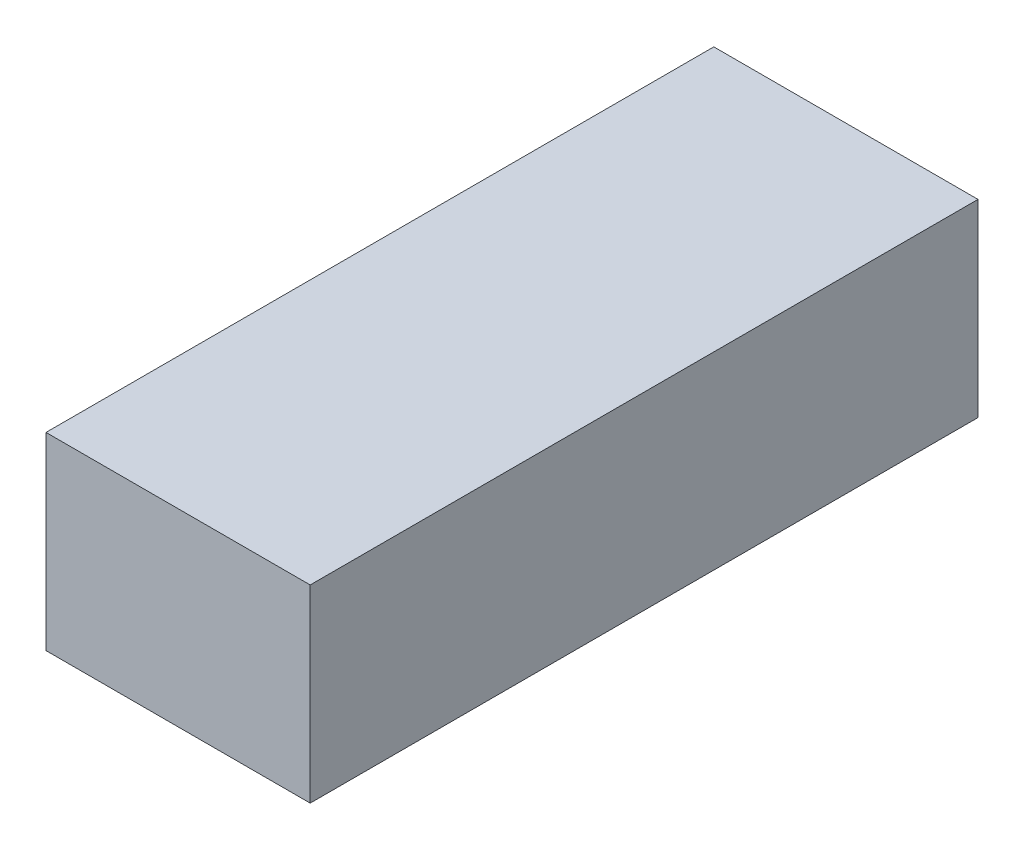
ISO-10303-21;
HEADER;
FILE_DESCRIPTION(('STEP AP214'),'2;1');
FILE_NAME('part.step','',(''),(''),'','','');
FILE_SCHEMA(('AUTOMOTIVE_DESIGN { 1 0 10303 214 1 1 1 1 }'));
ENDSEC;
DATA;
#1=APPLICATION_CONTEXT('core data for automotive mechanical design processes');
#2=APPLICATION_PROTOCOL_DEFINITION('international standard','automotive_design',2000,#1);
#3=PRODUCT_CONTEXT('',#1,'mechanical');
#4=PRODUCT('Part','Part','',(#3));
#5=PRODUCT_RELATED_PRODUCT_CATEGORY('part','',(#4));
#6=PRODUCT_DEFINITION_FORMATION('','',#4);
#7=PRODUCT_DEFINITION_CONTEXT('part definition',#1,'design');
#8=PRODUCT_DEFINITION('design','',#6,#7);
#9=PRODUCT_DEFINITION_SHAPE('','',#8);
#10=(LENGTH_UNIT() NAMED_UNIT(*) SI_UNIT(.MILLI.,.METRE.));
#11=(NAMED_UNIT(*) PLANE_ANGLE_UNIT() SI_UNIT($,.RADIAN.));
#12=(NAMED_UNIT(*) SI_UNIT($,.STERADIAN.) SOLID_ANGLE_UNIT());
#13=UNCERTAINTY_MEASURE_WITH_UNIT(LENGTH_MEASURE(1.E-05),#10,'distance_accuracy_value','');
#14=(GEOMETRIC_REPRESENTATION_CONTEXT(3) GLOBAL_UNCERTAINTY_ASSIGNED_CONTEXT((#13)) GLOBAL_UNIT_ASSIGNED_CONTEXT((#10,
#11,#12)) REPRESENTATION_CONTEXT('',''));
#15=CARTESIAN_POINT('',(0.,0.,0.));
#16=DIRECTION('',(0.,0.,1.));
#17=DIRECTION('',(1.,0.,0.));
#18=AXIS2_PLACEMENT_3D('',#15,#16,#17);
#19=CARTESIAN_POINT('',(-36.,25.75,-91.));
#20=DIRECTION('',(1.,0.,0.));
#21=DIRECTION('',(0.,0.,-1.));
#22=AXIS2_PLACEMENT_3D('',#19,#20,#21);
#23=PLANE('',#22);
#24=DIRECTION('',(0.,0.,1.));
#25=VECTOR('',#24,1.);
#26=CARTESIAN_POINT('',(-36.,-25.75,-91.));
#27=LINE('',#26,#25);
#28=CARTESIAN_POINT('',(-36.,-25.75,-91.));
#29=VERTEX_POINT('',#28);
#30=CARTESIAN_POINT('',(-36.,-25.75,91.));
#31=VERTEX_POINT('',#30);
#32=EDGE_CURVE('E107',#29,#31,#27,.T.);
#33=ORIENTED_EDGE('',*,*,#32,.T.);
#34=DIRECTION('',(0.,-1.,0.));
#35=VECTOR('',#34,1.);
#36=CARTESIAN_POINT('',(-36.,25.75,91.));
#37=LINE('',#36,#35);
#38=CARTESIAN_POINT('',(-36.,25.75,91.));
#39=VERTEX_POINT('',#38);
#40=EDGE_CURVE('E11',#39,#31,#37,.T.);
#41=ORIENTED_EDGE('',*,*,#40,.F.);
#42=DIRECTION('',(0.,0.,1.));
#43=VECTOR('',#42,1.);
#44=CARTESIAN_POINT('',(-36.,25.75,-91.));
#45=LINE('',#44,#43);
#46=CARTESIAN_POINT('',(-36.,25.75,-91.));
#47=VERTEX_POINT('',#46);
#48=EDGE_CURVE('E91',#47,#39,#45,.T.);
#49=ORIENTED_EDGE('',*,*,#48,.F.);
#50=DIRECTION('',(0.,-1.,0.));
#51=VECTOR('',#50,1.);
#52=CARTESIAN_POINT('',(-36.,25.75,-91.));
#53=LINE('',#52,#51);
#54=EDGE_CURVE('E103',#47,#29,#53,.T.);
#55=ORIENTED_EDGE('',*,*,#54,.T.);
#56=EDGE_LOOP('',(#33,#41,#49,#55));
#57=FACE_BOUND('',#56,.T.);
#58=ADVANCED_FACE('F39',(#57),#23,.F.);
#59=CARTESIAN_POINT('',(-36.,25.75,91.));
#60=DIRECTION('',(0.,0.,-1.));
#61=DIRECTION('',(-1.,0.,0.));
#62=AXIS2_PLACEMENT_3D('',#59,#60,#61);
#63=PLANE('',#62);
#64=DIRECTION('',(1.,0.,0.));
#65=VECTOR('',#64,1.);
#66=CARTESIAN_POINT('',(-36.,-25.75,91.));
#67=LINE('',#66,#65);
#68=CARTESIAN_POINT('',(36.,-25.75,91.));
#69=VERTEX_POINT('',#68);
#70=EDGE_CURVE('E96',#31,#69,#67,.T.);
#71=ORIENTED_EDGE('',*,*,#70,.T.);
#72=DIRECTION('',(0.,-1.,0.));
#73=VECTOR('',#72,1.);
#74=CARTESIAN_POINT('',(36.,25.75,91.));
#75=LINE('',#74,#73);
#76=CARTESIAN_POINT('',(36.,25.75,91.));
#77=VERTEX_POINT('',#76);
#78=EDGE_CURVE('E48',#77,#69,#75,.T.);
#79=ORIENTED_EDGE('',*,*,#78,.F.);
#80=DIRECTION('',(1.,0.,0.));
#81=VECTOR('',#80,1.);
#82=CARTESIAN_POINT('',(-36.,25.75,91.));
#83=LINE('',#82,#81);
#84=EDGE_CURVE('E86',#39,#77,#83,.T.);
#85=ORIENTED_EDGE('',*,*,#84,.F.);
#86=ORIENTED_EDGE('',*,*,#40,.T.);
#87=EDGE_LOOP('',(#71,#79,#85,#86));
#88=FACE_BOUND('',#87,.T.);
#89=ADVANCED_FACE('F95',(#88),#63,.F.);
#90=CARTESIAN_POINT('',(36.,25.75,-91.));
#91=DIRECTION('',(-1.,0.,0.));
#92=DIRECTION('',(0.,0.,1.));
#93=AXIS2_PLACEMENT_3D('',#90,#91,#92);
#94=PLANE('',#93);
#95=DIRECTION('',(0.,0.,-1.));
#96=VECTOR('',#95,1.);
#97=CARTESIAN_POINT('',(36.,-25.75,-91.));
#98=LINE('',#97,#96);
#99=CARTESIAN_POINT('',(36.,-25.75,-91.));
#100=VERTEX_POINT('',#99);
#101=EDGE_CURVE('E73',#69,#100,#98,.T.);
#102=ORIENTED_EDGE('',*,*,#101,.T.);
#103=DIRECTION('',(0.,-1.,0.));
#104=VECTOR('',#103,1.);
#105=CARTESIAN_POINT('',(36.,25.75,-91.));
#106=LINE('',#105,#104);
#107=CARTESIAN_POINT('',(36.,25.75,-91.));
#108=VERTEX_POINT('',#107);
#109=EDGE_CURVE('E98',#108,#100,#106,.T.);
#110=ORIENTED_EDGE('',*,*,#109,.F.);
#111=DIRECTION('',(0.,0.,-1.));
#112=VECTOR('',#111,1.);
#113=CARTESIAN_POINT('',(36.,25.75,-91.));
#114=LINE('',#113,#112);
#115=EDGE_CURVE('E89',#77,#108,#114,.T.);
#116=ORIENTED_EDGE('',*,*,#115,.F.);
#117=ORIENTED_EDGE('',*,*,#78,.T.);
#118=EDGE_LOOP('',(#102,#110,#116,#117));
#119=FACE_BOUND('',#118,.T.);
#120=ADVANCED_FACE('F99',(#119),#94,.F.);
#121=CARTESIAN_POINT('',(-36.,25.75,-91.));
#122=DIRECTION('',(0.,0.,1.));
#123=DIRECTION('',(1.,0.,0.));
#124=AXIS2_PLACEMENT_3D('',#121,#122,#123);
#125=PLANE('',#124);
#126=DIRECTION('',(-1.,0.,0.));
#127=VECTOR('',#126,1.);
#128=CARTESIAN_POINT('',(-36.,-25.75,-91.));
#129=LINE('',#128,#127);
#130=EDGE_CURVE('E79',#100,#29,#129,.T.);
#131=ORIENTED_EDGE('',*,*,#130,.T.);
#132=ORIENTED_EDGE('',*,*,#54,.F.);
#133=DIRECTION('',(-1.,0.,0.));
#134=VECTOR('',#133,1.);
#135=CARTESIAN_POINT('',(-36.,25.75,-91.));
#136=LINE('',#135,#134);
#137=EDGE_CURVE('E56',#108,#47,#136,.T.);
#138=ORIENTED_EDGE('',*,*,#137,.F.);
#139=ORIENTED_EDGE('',*,*,#109,.T.);
#140=EDGE_LOOP('',(#131,#132,#138,#139));
#141=FACE_BOUND('',#140,.T.);
#142=ADVANCED_FACE('F120',(#141),#125,.F.);
#143=CARTESIAN_POINT('',(0.,25.75,0.));
#144=DIRECTION('',(0.,1.,0.));
#145=DIRECTION('',(0.,0.,1.));
#146=AXIS2_PLACEMENT_3D('',#143,#144,#145);
#147=PLANE('',#146);
#148=ORIENTED_EDGE('',*,*,#48,.T.);
#149=ORIENTED_EDGE('',*,*,#84,.T.);
#150=ORIENTED_EDGE('',*,*,#115,.T.);
#151=ORIENTED_EDGE('',*,*,#137,.T.);
#152=EDGE_LOOP('',(#148,#149,#150,#151));
#153=FACE_BOUND('',#152,.T.);
#154=ADVANCED_FACE('F87',(#153),#147,.T.);
#155=CARTESIAN_POINT('',(0.,-25.75,0.));
#156=DIRECTION('',(0.,1.,0.));
#157=DIRECTION('',(0.,0.,1.));
#158=AXIS2_PLACEMENT_3D('',#155,#156,#157);
#159=PLANE('',#158);
#160=ORIENTED_EDGE('',*,*,#32,.F.);
#161=ORIENTED_EDGE('',*,*,#130,.F.);
#162=ORIENTED_EDGE('',*,*,#101,.F.);
#163=ORIENTED_EDGE('',*,*,#70,.F.);
#164=EDGE_LOOP('',(#160,#161,#162,#163));
#165=FACE_BOUND('',#164,.T.);
#166=ADVANCED_FACE('F123',(#165),#159,.F.);
#167=CLOSED_SHELL('',(#58,#89,#120,#142,#154,#166));
#168=MANIFOLD_SOLID_BREP('B2',#167);
#169=ADVANCED_BREP_SHAPE_REPRESENTATION('',(#18,#168),#14);
#170=SHAPE_DEFINITION_REPRESENTATION(#9,#169);
ENDSEC;
END-ISO-10303-21;
